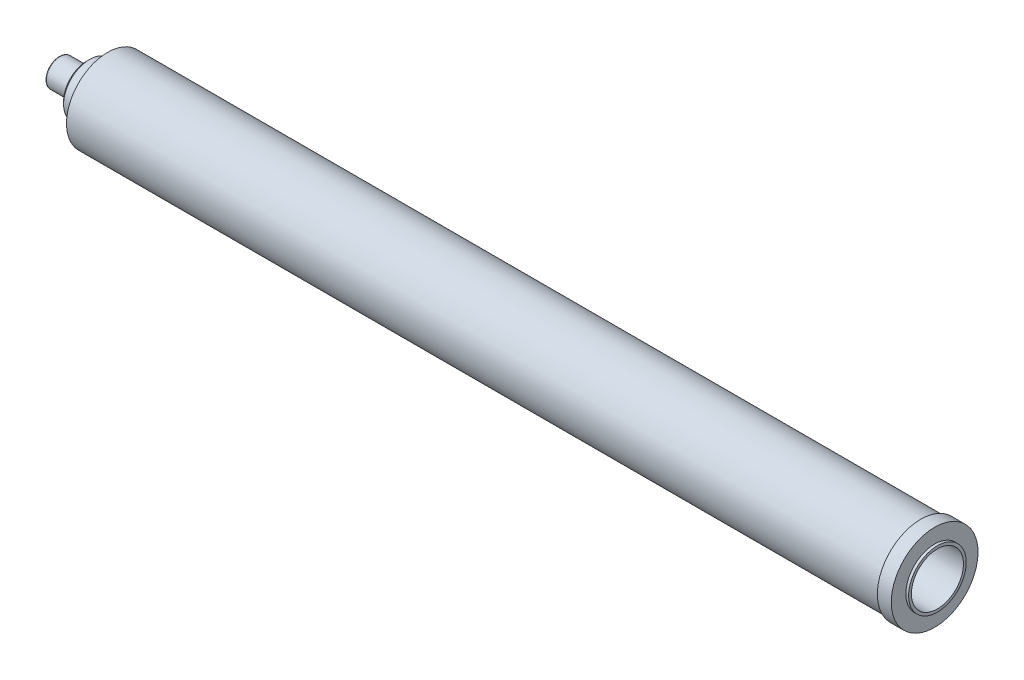
ISO-10303-21;
HEADER;
FILE_DESCRIPTION(('STEP AP214'),'2;1');
FILE_NAME('part.step','',(''),(''),'','','');
FILE_SCHEMA(('AUTOMOTIVE_DESIGN { 1 0 10303 214 1 1 1 1 }'));
ENDSEC;
DATA;
#1=APPLICATION_CONTEXT('core data for automotive mechanical design processes');
#2=APPLICATION_PROTOCOL_DEFINITION('international standard','automotive_design',2000,#1);
#3=PRODUCT_CONTEXT('',#1,'mechanical');
#4=PRODUCT('Part','Part','',(#3));
#5=PRODUCT_RELATED_PRODUCT_CATEGORY('part','',(#4));
#6=PRODUCT_DEFINITION_FORMATION('','',#4);
#7=PRODUCT_DEFINITION_CONTEXT('part definition',#1,'design');
#8=PRODUCT_DEFINITION('design','',#6,#7);
#9=PRODUCT_DEFINITION_SHAPE('','',#8);
#10=(LENGTH_UNIT() NAMED_UNIT(*) SI_UNIT(.MILLI.,.METRE.));
#11=(NAMED_UNIT(*) PLANE_ANGLE_UNIT() SI_UNIT($,.RADIAN.));
#12=(NAMED_UNIT(*) SI_UNIT($,.STERADIAN.) SOLID_ANGLE_UNIT());
#13=UNCERTAINTY_MEASURE_WITH_UNIT(LENGTH_MEASURE(1.E-05),#10,'distance_accuracy_value','');
#14=(GEOMETRIC_REPRESENTATION_CONTEXT(3) GLOBAL_UNCERTAINTY_ASSIGNED_CONTEXT((#13)) GLOBAL_UNIT_ASSIGNED_CONTEXT((#10,
#11,#12)) REPRESENTATION_CONTEXT('',''));
#15=CARTESIAN_POINT('',(0.,0.,0.));
#16=DIRECTION('',(0.,0.,1.));
#17=DIRECTION('',(1.,0.,0.));
#18=AXIS2_PLACEMENT_3D('',#15,#16,#17);
#19=CARTESIAN_POINT('',(0.,0.,0.));
#20=DIRECTION('',(-1.,0.,0.));
#21=DIRECTION('',(0.,-1.,0.));
#22=AXIS2_PLACEMENT_3D('',#19,#20,#21);
#23=PLANE('',#22);
#24=CARTESIAN_POINT('',(0.,0.,0.));
#25=DIRECTION('',(-1.,0.,0.));
#26=DIRECTION('',(0.,-1.,0.));
#27=AXIS2_PLACEMENT_3D('',#24,#25,#26);
#28=CIRCLE('',#27,11.43);
#29=CARTESIAN_POINT('',(0.,-11.43,0.));
#30=VERTEX_POINT('',#29);
#31=EDGE_CURVE('E11',#30,#30,#28,.T.);
#32=ORIENTED_EDGE('',*,*,#31,.T.);
#33=EDGE_LOOP('',(#32));
#34=FACE_BOUND('',#33,.T.);
#35=CARTESIAN_POINT('',(0.,0.,0.));
#36=DIRECTION('',(-1.,0.,0.));
#37=DIRECTION('',(0.,0.,1.));
#38=AXIS2_PLACEMENT_3D('',#35,#36,#37);
#39=CIRCLE('',#38,9.6774);
#40=CARTESIAN_POINT('',(0.,0.,9.6774));
#41=VERTEX_POINT('',#40);
#42=EDGE_CURVE('E65',#41,#41,#39,.T.);
#43=ORIENTED_EDGE('',*,*,#42,.F.);
#44=EDGE_LOOP('',(#43));
#45=FACE_BOUND('',#44,.T.);
#46=ADVANCED_FACE('F38',(#34,#45),#23,.T.);
#47=CARTESIAN_POINT('',(801.116,0.,0.));
#48=DIRECTION('',(1.,0.,0.));
#49=DIRECTION('',(0.,1.,0.));
#50=AXIS2_PLACEMENT_3D('',#47,#48,#49);
#51=CYLINDRICAL_SURFACE('',#50,12.7);
#52=CARTESIAN_POINT('',(1.26999999999999,0.,0.));
#53=DIRECTION('',(-1.,0.,0.));
#54=DIRECTION('',(0.,-1.,0.));
#55=AXIS2_PLACEMENT_3D('',#52,#53,#54);
#56=CIRCLE('',#55,12.7);
#57=CARTESIAN_POINT('',(1.26999999999999,-12.7,0.));
#58=VERTEX_POINT('',#57);
#59=EDGE_CURVE('E45',#58,#58,#56,.F.);
#60=ORIENTED_EDGE('',*,*,#59,.T.);
#61=EDGE_LOOP('',(#60));
#62=FACE_BOUND('',#61,.T.);
#63=CARTESIAN_POINT('',(25.4,0.,0.));
#64=DIRECTION('',(1.,0.,0.));
#65=DIRECTION('',(0.,1.,0.));
#66=AXIS2_PLACEMENT_3D('',#63,#64,#65);
#67=CIRCLE('',#66,12.7);
#68=CARTESIAN_POINT('',(25.4,12.7,0.));
#69=VERTEX_POINT('',#68);
#70=EDGE_CURVE('E80',#69,#69,#67,.T.);
#71=ORIENTED_EDGE('',*,*,#70,.F.);
#72=EDGE_LOOP('',(#71));
#73=FACE_BOUND('',#72,.T.);
#74=ADVANCED_FACE('F91',(#62,#73),#51,.T.);
#75=CARTESIAN_POINT('',(25.4,12.7,0.));
#76=DIRECTION('',(-1.,0.,0.));
#77=DIRECTION('',(0.,-1.,0.));
#78=AXIS2_PLACEMENT_3D('',#75,#76,#77);
#79=PLANE('',#78);
#80=CARTESIAN_POINT('',(25.4,0.,0.));
#81=DIRECTION('',(-1.,0.,0.));
#82=DIRECTION('',(0.,-1.,0.));
#83=AXIS2_PLACEMENT_3D('',#80,#81,#82);
#84=CIRCLE('',#83,21.2724999999999);
#85=CARTESIAN_POINT('',(25.4,-21.2724999999999,0.));
#86=VERTEX_POINT('',#85);
#87=EDGE_CURVE('E86',#86,#86,#84,.T.);
#88=ORIENTED_EDGE('',*,*,#87,.T.);
#89=EDGE_LOOP('',(#88));
#90=FACE_BOUND('',#89,.T.);
#91=ORIENTED_EDGE('',*,*,#70,.T.);
#92=EDGE_LOOP('',(#91));
#93=FACE_BOUND('',#92,.T.);
#94=ADVANCED_FACE('F114',(#90,#93),#79,.T.);
#95=CARTESIAN_POINT('',(801.116,0.,0.));
#96=DIRECTION('',(1.,0.,0.));
#97=DIRECTION('',(0.,1.,0.));
#98=AXIS2_PLACEMENT_3D('',#95,#96,#97);
#99=CYLINDRICAL_SURFACE('',#98,23.8125);
#100=CARTESIAN_POINT('',(27.9400000000001,0.,0.));
#101=DIRECTION('',(-1.,0.,0.));
#102=DIRECTION('',(0.,-1.,0.));
#103=AXIS2_PLACEMENT_3D('',#100,#101,#102);
#104=CIRCLE('',#103,23.8125);
#105=CARTESIAN_POINT('',(27.9400000000001,-23.8125,0.));
#106=VERTEX_POINT('',#105);
#107=EDGE_CURVE('E83',#106,#106,#104,.F.);
#108=ORIENTED_EDGE('',*,*,#107,.T.);
#109=EDGE_LOOP('',(#108));
#110=FACE_BOUND('',#109,.T.);
#111=CARTESIAN_POINT('',(44.45,0.,0.));
#112=DIRECTION('',(1.,0.,0.));
#113=DIRECTION('',(0.,1.,0.));
#114=AXIS2_PLACEMENT_3D('',#111,#112,#113);
#115=CIRCLE('',#114,23.8125);
#116=CARTESIAN_POINT('',(44.45,23.8125,0.));
#117=VERTEX_POINT('',#116);
#118=EDGE_CURVE('E77',#117,#117,#115,.T.);
#119=ORIENTED_EDGE('',*,*,#118,.F.);
#120=EDGE_LOOP('',(#119));
#121=FACE_BOUND('',#120,.T.);
#122=ADVANCED_FACE('F134',(#110,#121),#99,.T.);
#123=CARTESIAN_POINT('',(44.45,23.8125,0.));
#124=DIRECTION('',(-1.,0.,0.));
#125=DIRECTION('',(0.,-1.,0.));
#126=AXIS2_PLACEMENT_3D('',#123,#124,#125);
#127=PLANE('',#126);
#128=ORIENTED_EDGE('',*,*,#118,.T.);
#129=EDGE_LOOP('',(#128));
#130=FACE_BOUND('',#129,.T.);
#131=CARTESIAN_POINT('',(44.45,0.,0.));
#132=DIRECTION('',(1.,0.,0.));
#133=DIRECTION('',(0.,1.,0.));
#134=AXIS2_PLACEMENT_3D('',#131,#132,#133);
#135=CIRCLE('',#134,37.6554999999999);
#136=CARTESIAN_POINT('',(44.45,37.6554999999999,0.));
#137=VERTEX_POINT('',#136);
#138=EDGE_CURVE('E74',#137,#137,#135,.T.);
#139=ORIENTED_EDGE('',*,*,#138,.F.);
#140=EDGE_LOOP('',(#139));
#141=FACE_BOUND('',#140,.T.);
#142=ADVANCED_FACE('F137',(#130,#141),#127,.T.);
#143=CARTESIAN_POINT('',(801.116,0.,0.));
#144=DIRECTION('',(1.,0.,0.));
#145=DIRECTION('',(0.,1.,0.));
#146=AXIS2_PLACEMENT_3D('',#143,#144,#145);
#147=CYLINDRICAL_SURFACE('',#146,37.6554999999999);
#148=ORIENTED_EDGE('',*,*,#138,.T.);
#149=EDGE_LOOP('',(#148));
#150=FACE_BOUND('',#149,.T.);
#151=CARTESIAN_POINT('',(788.416,0.,0.));
#152=DIRECTION('',(1.,0.,0.));
#153=DIRECTION('',(0.,1.,0.));
#154=AXIS2_PLACEMENT_3D('',#151,#152,#153);
#155=CIRCLE('',#154,37.6554999999999);
#156=CARTESIAN_POINT('',(788.416,37.6554999999999,0.));
#157=VERTEX_POINT('',#156);
#158=EDGE_CURVE('E71',#157,#157,#155,.T.);
#159=ORIENTED_EDGE('',*,*,#158,.F.);
#160=EDGE_LOOP('',(#159));
#161=FACE_BOUND('',#160,.T.);
#162=ADVANCED_FACE('F143',(#150,#161),#147,.T.);
#163=CARTESIAN_POINT('',(788.416,37.6554999999999,0.));
#164=DIRECTION('',(-1.,0.,0.));
#165=DIRECTION('',(0.,-1.,0.));
#166=AXIS2_PLACEMENT_3D('',#163,#164,#165);
#167=PLANE('',#166);
#168=ORIENTED_EDGE('',*,*,#158,.T.);
#169=EDGE_LOOP('',(#168));
#170=FACE_BOUND('',#169,.T.);
#171=CARTESIAN_POINT('',(788.416,0.,0.));
#172=DIRECTION('',(1.,0.,0.));
#173=DIRECTION('',(0.,1.,0.));
#174=AXIS2_PLACEMENT_3D('',#171,#172,#173);
#175=CIRCLE('',#174,39.6875);
#176=CARTESIAN_POINT('',(788.416,39.6875,0.));
#177=VERTEX_POINT('',#176);
#178=EDGE_CURVE('E62',#177,#177,#175,.T.);
#179=ORIENTED_EDGE('',*,*,#178,.F.);
#180=EDGE_LOOP('',(#179));
#181=FACE_BOUND('',#180,.T.);
#182=ADVANCED_FACE('F149',(#170,#181),#167,.T.);
#183=CARTESIAN_POINT('',(801.116,0.,0.));
#184=DIRECTION('',(1.,0.,0.));
#185=DIRECTION('',(0.,1.,0.));
#186=AXIS2_PLACEMENT_3D('',#183,#184,#185);
#187=CYLINDRICAL_SURFACE('',#186,39.6875);
#188=ORIENTED_EDGE('',*,*,#178,.T.);
#189=EDGE_LOOP('',(#188));
#190=FACE_BOUND('',#189,.T.);
#191=CARTESIAN_POINT('',(801.116,0.,0.));
#192=DIRECTION('',(1.,0.,0.));
#193=DIRECTION('',(0.,1.,0.));
#194=AXIS2_PLACEMENT_3D('',#191,#192,#193);
#195=CIRCLE('',#194,39.6875);
#196=CARTESIAN_POINT('',(801.116,39.6875,0.));
#197=VERTEX_POINT('',#196);
#198=EDGE_CURVE('E58',#197,#197,#195,.T.);
#199=ORIENTED_EDGE('',*,*,#198,.F.);
#200=EDGE_LOOP('',(#199));
#201=FACE_BOUND('',#200,.T.);
#202=ADVANCED_FACE('F127',(#190,#201),#187,.T.);
#203=CARTESIAN_POINT('',(801.116,39.6875,0.));
#204=DIRECTION('',(1.,0.,0.));
#205=DIRECTION('',(0.,1.,0.));
#206=AXIS2_PLACEMENT_3D('',#203,#204,#205);
#207=PLANE('',#206);
#208=CARTESIAN_POINT('',(801.116,0.,0.));
#209=DIRECTION('',(1.,0.,0.));
#210=DIRECTION('',(0.,1.,0.));
#211=AXIS2_PLACEMENT_3D('',#208,#209,#210);
#212=CIRCLE('',#211,26.3525);
#213=CARTESIAN_POINT('',(801.116,26.3525,0.));
#214=VERTEX_POINT('',#213);
#215=EDGE_CURVE('E272',#214,#214,#212,.T.);
#216=ORIENTED_EDGE('',*,*,#215,.F.);
#217=EDGE_LOOP('',(#216));
#218=FACE_BOUND('',#217,.T.);
#219=ORIENTED_EDGE('',*,*,#198,.T.);
#220=EDGE_LOOP('',(#219));
#221=FACE_BOUND('',#220,.T.);
#222=ADVANCED_FACE('F122',(#218,#221),#207,.T.);
#223=CARTESIAN_POINT('',(27.9400000000001,0.,0.));
#224=DIRECTION('',(1.,0.,0.));
#225=DIRECTION('',(0.,1.,0.));
#226=AXIS2_PLACEMENT_3D('',#223,#224,#225);
#227=CONICAL_SURFACE('',#226,23.8125,0.785398163397438);
#228=ORIENTED_EDGE('',*,*,#87,.F.);
#229=EDGE_LOOP('',(#228));
#230=FACE_BOUND('',#229,.T.);
#231=ORIENTED_EDGE('',*,*,#107,.F.);
#232=EDGE_LOOP('',(#231));
#233=FACE_BOUND('',#232,.T.);
#234=ADVANCED_FACE('F52',(#230,#233),#227,.T.);
#235=CARTESIAN_POINT('',(25.4,0.,0.));
#236=DIRECTION('',(-1.,0.,0.));
#237=DIRECTION('',(0.,0.,1.));
#238=AXIS2_PLACEMENT_3D('',#235,#236,#237);
#239=CONICAL_SURFACE('',#238,5.0419,1.02974425867665);
#240=CARTESIAN_POINT('',(28.4294791550751,0.,0.));
#241=VERTEX_POINT('',#240);
#242=VERTEX_LOOP('',#241);
#243=FACE_BOUND('',#242,.T.);
#244=CARTESIAN_POINT('',(25.4,0.,0.));
#245=DIRECTION('',(-1.,0.,0.));
#246=DIRECTION('',(0.,0.,1.));
#247=AXIS2_PLACEMENT_3D('',#244,#245,#246);
#248=CIRCLE('',#247,5.0419);
#249=CARTESIAN_POINT('',(25.4,0.,5.0419));
#250=VERTEX_POINT('',#249);
#251=EDGE_CURVE('E56',#250,#250,#248,.T.);
#252=ORIENTED_EDGE('',*,*,#251,.T.);
#253=EDGE_LOOP('',(#252));
#254=FACE_BOUND('',#253,.T.);
#255=ADVANCED_FACE('F48',(#243,#254),#239,.F.);
#256=CARTESIAN_POINT('',(0.,0.,0.));
#257=DIRECTION('',(-1.,0.,0.));
#258=DIRECTION('',(0.,0.,1.));
#259=AXIS2_PLACEMENT_3D('',#256,#257,#258);
#260=CYLINDRICAL_SURFACE('',#259,5.0419);
#261=ORIENTED_EDGE('',*,*,#251,.F.);
#262=EDGE_LOOP('',(#261));
#263=FACE_BOUND('',#262,.T.);
#264=CARTESIAN_POINT('',(3.88964634032228,0.,0.));
#265=DIRECTION('',(-1.,0.,0.));
#266=DIRECTION('',(0.,0.,1.));
#267=AXIS2_PLACEMENT_3D('',#264,#265,#266);
#268=CIRCLE('',#267,5.0419);
#269=CARTESIAN_POINT('',(3.88964634032228,0.,5.0419));
#270=VERTEX_POINT('',#269);
#271=EDGE_CURVE('E59',#270,#270,#268,.T.);
#272=ORIENTED_EDGE('',*,*,#271,.T.);
#273=EDGE_LOOP('',(#272));
#274=FACE_BOUND('',#273,.T.);
#275=ADVANCED_FACE('F51',(#263,#274),#260,.F.);
#276=CARTESIAN_POINT('',(0.,0.,0.));
#277=DIRECTION('',(-1.,0.,0.));
#278=DIRECTION('',(0.,0.,1.));
#279=AXIS2_PLACEMENT_3D('',#276,#277,#278);
#280=CONICAL_SURFACE('',#279,9.6774,0.872664625997165);
#281=ORIENTED_EDGE('',*,*,#271,.F.);
#282=EDGE_LOOP('',(#281));
#283=FACE_BOUND('',#282,.T.);
#284=ORIENTED_EDGE('',*,*,#42,.T.);
#285=EDGE_LOOP('',(#284));
#286=FACE_BOUND('',#285,.T.);
#287=ADVANCED_FACE('F96',(#283,#286),#280,.F.);
#288=CARTESIAN_POINT('',(1.26999999999999,0.,0.));
#289=DIRECTION('',(-1.,0.,0.));
#290=DIRECTION('',(0.,-1.,0.));
#291=AXIS2_PLACEMENT_3D('',#288,#289,#290);
#292=TOROIDAL_SURFACE('',#291,11.43,1.27);
#293=ORIENTED_EDGE('',*,*,#31,.F.);
#294=EDGE_LOOP('',(#293));
#295=FACE_BOUND('',#294,.T.);
#296=ORIENTED_EDGE('',*,*,#59,.F.);
#297=EDGE_LOOP('',(#296));
#298=FACE_BOUND('',#297,.T.);
#299=ADVANCED_FACE('F40',(#295,#298),#292,.T.);
#300=CARTESIAN_POINT('',(803.656,0.,0.));
#301=DIRECTION('',(1.,0.,0.));
#302=DIRECTION('',(0.,1.,0.));
#303=AXIS2_PLACEMENT_3D('',#300,#301,#302);
#304=PLANE('',#303);
#305=CARTESIAN_POINT('',(803.656,0.,0.));
#306=DIRECTION('',(1.,0.,0.));
#307=DIRECTION('',(0.,1.,0.));
#308=AXIS2_PLACEMENT_3D('',#305,#306,#307);
#309=CIRCLE('',#308,26.3525);
#310=CARTESIAN_POINT('',(803.656,26.3525,0.));
#311=VERTEX_POINT('',#310);
#312=EDGE_CURVE('E275',#311,#311,#309,.T.);
#313=ORIENTED_EDGE('',*,*,#312,.T.);
#314=EDGE_LOOP('',(#313));
#315=FACE_BOUND('',#314,.T.);
#316=CARTESIAN_POINT('',(803.656,0.,0.));
#317=DIRECTION('',(1.,0.,0.));
#318=DIRECTION('',(0.,1.,0.));
#319=AXIS2_PLACEMENT_3D('',#316,#317,#318);
#320=CIRCLE('',#319,23.8125);
#321=CARTESIAN_POINT('',(803.656,23.8125,0.));
#322=VERTEX_POINT('',#321);
#323=EDGE_CURVE('E269',#322,#322,#320,.T.);
#324=ORIENTED_EDGE('',*,*,#323,.F.);
#325=EDGE_LOOP('',(#324));
#326=FACE_BOUND('',#325,.T.);
#327=ADVANCED_FACE('F95',(#315,#326),#304,.T.);
#328=CARTESIAN_POINT('',(803.656,0.,0.));
#329=DIRECTION('',(-1.,0.,0.));
#330=DIRECTION('',(0.,-1.,0.));
#331=AXIS2_PLACEMENT_3D('',#328,#329,#330);
#332=CYLINDRICAL_SURFACE('',#331,26.3525);
#333=ORIENTED_EDGE('',*,*,#312,.F.);
#334=EDGE_LOOP('',(#333));
#335=FACE_BOUND('',#334,.T.);
#336=ORIENTED_EDGE('',*,*,#215,.T.);
#337=EDGE_LOOP('',(#336));
#338=FACE_BOUND('',#337,.T.);
#339=ADVANCED_FACE('F102',(#335,#338),#332,.T.);
#340=CARTESIAN_POINT('',(803.656,0.,0.));
#341=DIRECTION('',(-1.,0.,0.));
#342=DIRECTION('',(0.,-1.,0.));
#343=AXIS2_PLACEMENT_3D('',#340,#341,#342);
#344=CYLINDRICAL_SURFACE('',#343,23.8125);
#345=ORIENTED_EDGE('',*,*,#323,.T.);
#346=EDGE_LOOP('',(#345));
#347=FACE_BOUND('',#346,.T.);
#348=CARTESIAN_POINT('',(295.656,0.,0.));
#349=DIRECTION('',(1.,0.,0.));
#350=DIRECTION('',(0.,1.,0.));
#351=AXIS2_PLACEMENT_3D('',#348,#349,#350);
#352=CIRCLE('',#351,23.8125);
#353=CARTESIAN_POINT('',(295.656,23.8125,0.));
#354=VERTEX_POINT('',#353);
#355=EDGE_CURVE('E267',#354,#354,#352,.T.);
#356=ORIENTED_EDGE('',*,*,#355,.F.);
#357=EDGE_LOOP('',(#356));
#358=FACE_BOUND('',#357,.T.);
#359=ADVANCED_FACE('F238',(#347,#358),#344,.F.);
#360=CARTESIAN_POINT('',(295.656,0.,0.));
#361=DIRECTION('',(1.,0.,0.));
#362=DIRECTION('',(0.,1.,0.));
#363=AXIS2_PLACEMENT_3D('',#360,#361,#362);
#364=PLANE('',#363);
#365=ORIENTED_EDGE('',*,*,#355,.T.);
#366=EDGE_LOOP('',(#365));
#367=FACE_BOUND('',#366,.T.);
#368=ADVANCED_FACE('F247',(#367),#364,.T.);
#369=CLOSED_SHELL('',(#46,#74,#94,#122,#142,#162,#182,#202,#222,#234,#255,#275,#287,#299,#327,
#339,#359,#368));
#370=MANIFOLD_SOLID_BREP('B2',#369);
#371=ADVANCED_BREP_SHAPE_REPRESENTATION('',(#18,#370),#14);
#372=SHAPE_DEFINITION_REPRESENTATION(#9,#371);
ENDSEC;
END-ISO-10303-21;
